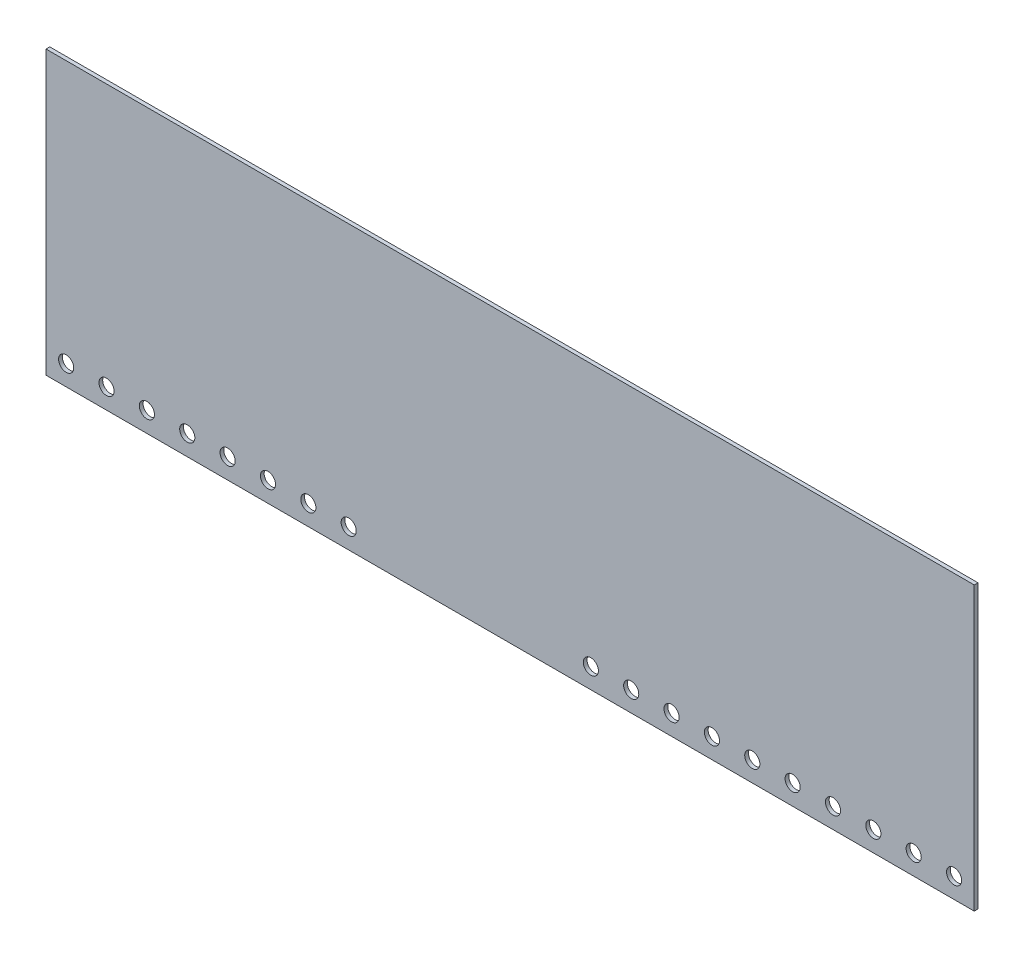
ISO-10303-21;
HEADER;
FILE_DESCRIPTION(('STEP AP214'),'2;1');
FILE_NAME('part.step','',(''),(''),'','','');
FILE_SCHEMA(('AUTOMOTIVE_DESIGN { 1 0 10303 214 1 1 1 1 }'));
ENDSEC;
DATA;
#1=APPLICATION_CONTEXT('core data for automotive mechanical design processes');
#2=APPLICATION_PROTOCOL_DEFINITION('international standard','automotive_design',2000,#1);
#3=PRODUCT_CONTEXT('',#1,'mechanical');
#4=PRODUCT('Part','Part','',(#3));
#5=PRODUCT_RELATED_PRODUCT_CATEGORY('part','',(#4));
#6=PRODUCT_DEFINITION_FORMATION('','',#4);
#7=PRODUCT_DEFINITION_CONTEXT('part definition',#1,'design');
#8=PRODUCT_DEFINITION('design','',#6,#7);
#9=PRODUCT_DEFINITION_SHAPE('','',#8);
#10=(LENGTH_UNIT() NAMED_UNIT(*) SI_UNIT(.MILLI.,.METRE.));
#11=(NAMED_UNIT(*) PLANE_ANGLE_UNIT() SI_UNIT($,.RADIAN.));
#12=(NAMED_UNIT(*) SI_UNIT($,.STERADIAN.) SOLID_ANGLE_UNIT());
#13=UNCERTAINTY_MEASURE_WITH_UNIT(LENGTH_MEASURE(1.E-05),#10,'distance_accuracy_value','');
#14=(GEOMETRIC_REPRESENTATION_CONTEXT(3) GLOBAL_UNCERTAINTY_ASSIGNED_CONTEXT((#13)) GLOBAL_UNIT_ASSIGNED_CONTEXT((#10,
#11,#12)) REPRESENTATION_CONTEXT('',''));
#15=CARTESIAN_POINT('',(0.,0.,0.));
#16=DIRECTION('',(0.,0.,1.));
#17=DIRECTION('',(1.,0.,0.));
#18=AXIS2_PLACEMENT_3D('',#15,#16,#17);
#19=CARTESIAN_POINT('',(0.,0.,1.1811));
#20=DIRECTION('',(0.,0.,-1.));
#21=DIRECTION('',(-1.,0.,0.));
#22=AXIS2_PLACEMENT_3D('',#19,#20,#21);
#23=PLANE('',#22);
#24=DIRECTION('',(0.,-1.,0.));
#25=VECTOR('',#24,1.);
#26=CARTESIAN_POINT('',(-314.17952235108,-37.0940847558031,1.1811));
#27=LINE('',#26,#25);
#28=CARTESIAN_POINT('',(-314.17952235108,140.705915244197,1.1811));
#29=VERTEX_POINT('',#28);
#30=CARTESIAN_POINT('',(-314.17952235108,-37.0940847558031,1.1811));
#31=VERTEX_POINT('',#30);
#32=EDGE_CURVE('E85',#29,#31,#27,.T.);
#33=ORIENTED_EDGE('',*,*,#32,.T.);
#34=DIRECTION('',(1.,0.,0.));
#35=VECTOR('',#34,1.);
#36=CARTESIAN_POINT('',(-314.17952235108,-37.0940847558031,1.1811));
#37=LINE('',#36,#35);
#38=CARTESIAN_POINT('',(270.02047764892,-37.0940847558031,1.1811));
#39=VERTEX_POINT('',#38);
#40=EDGE_CURVE('E80',#31,#39,#37,.T.);
#41=ORIENTED_EDGE('',*,*,#40,.T.);
#42=DIRECTION('',(0.,1.,0.));
#43=VECTOR('',#42,1.);
#44=CARTESIAN_POINT('',(270.02047764892,-37.0940847558031,1.1811));
#45=LINE('',#44,#43);
#46=CARTESIAN_POINT('',(270.02047764892,140.705915244197,1.1811));
#47=VERTEX_POINT('',#46);
#48=EDGE_CURVE('E83',#39,#47,#45,.T.);
#49=ORIENTED_EDGE('',*,*,#48,.T.);
#50=DIRECTION('',(-1.,0.,0.));
#51=VECTOR('',#50,1.);
#52=CARTESIAN_POINT('',(-314.17952235108,140.705915244197,1.1811));
#53=LINE('',#52,#51);
#54=EDGE_CURVE('E50',#47,#29,#53,.T.);
#55=ORIENTED_EDGE('',*,*,#54,.T.);
#56=EDGE_LOOP('',(#33,#41,#49,#55));
#57=FACE_BOUND('',#56,.T.);
#58=CARTESIAN_POINT('',(-301.47952235108,-24.3940847558031,1.1811));
#59=DIRECTION('',(0.,0.,1.));
#60=DIRECTION('',(1.,0.,0.));
#61=AXIS2_PLACEMENT_3D('',#58,#59,#60);
#62=CIRCLE('',#61,4.76250000000003);
#63=CARTESIAN_POINT('',(-296.71702235108,-24.3940847558031,1.1811));
#64=VERTEX_POINT('',#63);
#65=EDGE_CURVE('E100',#64,#64,#62,.T.);
#66=ORIENTED_EDGE('',*,*,#65,.F.);
#67=EDGE_LOOP('',(#66));
#68=FACE_BOUND('',#67,.T.);
#69=CARTESIAN_POINT('',(-276.07952235108,-24.3940847558031,1.1811));
#70=DIRECTION('',(0.,0.,1.));
#71=DIRECTION('',(1.,0.,0.));
#72=AXIS2_PLACEMENT_3D('',#69,#70,#71);
#73=CIRCLE('',#72,4.76249999999994);
#74=CARTESIAN_POINT('',(-271.31702235108,-24.3940847558031,1.1811));
#75=VERTEX_POINT('',#74);
#76=EDGE_CURVE('E115',#75,#75,#73,.T.);
#77=ORIENTED_EDGE('',*,*,#76,.F.);
#78=EDGE_LOOP('',(#77));
#79=FACE_BOUND('',#78,.T.);
#80=CARTESIAN_POINT('',(-250.67952235108,-24.3940847558031,1.1811));
#81=DIRECTION('',(0.,0.,1.));
#82=DIRECTION('',(1.,0.,0.));
#83=AXIS2_PLACEMENT_3D('',#80,#81,#82);
#84=CIRCLE('',#83,4.76249999999994);
#85=CARTESIAN_POINT('',(-245.91702235108,-24.3940847558031,1.1811));
#86=VERTEX_POINT('',#85);
#87=EDGE_CURVE('E121',#86,#86,#84,.T.);
#88=ORIENTED_EDGE('',*,*,#87,.F.);
#89=EDGE_LOOP('',(#88));
#90=FACE_BOUND('',#89,.T.);
#91=CARTESIAN_POINT('',(-225.27952235108,-24.3940847558031,1.1811));
#92=DIRECTION('',(0.,0.,1.));
#93=DIRECTION('',(1.,0.,0.));
#94=AXIS2_PLACEMENT_3D('',#91,#92,#93);
#95=CIRCLE('',#94,4.76249999999994);
#96=CARTESIAN_POINT('',(-220.51702235108,-24.3940847558031,1.1811));
#97=VERTEX_POINT('',#96);
#98=EDGE_CURVE('E127',#97,#97,#95,.T.);
#99=ORIENTED_EDGE('',*,*,#98,.F.);
#100=EDGE_LOOP('',(#99));
#101=FACE_BOUND('',#100,.T.);
#102=CARTESIAN_POINT('',(-199.87952235108,-24.3940847558031,1.1811));
#103=DIRECTION('',(0.,0.,1.));
#104=DIRECTION('',(1.,0.,0.));
#105=AXIS2_PLACEMENT_3D('',#102,#103,#104);
#106=CIRCLE('',#105,4.76249999999994);
#107=CARTESIAN_POINT('',(-195.11702235108,-24.3940847558031,1.1811));
#108=VERTEX_POINT('',#107);
#109=EDGE_CURVE('E133',#108,#108,#106,.T.);
#110=ORIENTED_EDGE('',*,*,#109,.F.);
#111=EDGE_LOOP('',(#110));
#112=FACE_BOUND('',#111,.T.);
#113=CARTESIAN_POINT('',(-174.47952235108,-24.3940847558031,1.1811));
#114=DIRECTION('',(0.,0.,1.));
#115=DIRECTION('',(1.,0.,0.));
#116=AXIS2_PLACEMENT_3D('',#113,#114,#115);
#117=CIRCLE('',#116,4.76249999999994);
#118=CARTESIAN_POINT('',(-169.71702235108,-24.3940847558031,1.1811));
#119=VERTEX_POINT('',#118);
#120=EDGE_CURVE('E139',#119,#119,#117,.T.);
#121=ORIENTED_EDGE('',*,*,#120,.F.);
#122=EDGE_LOOP('',(#121));
#123=FACE_BOUND('',#122,.T.);
#124=CARTESIAN_POINT('',(-149.07952235108,-24.3940847558031,1.1811));
#125=DIRECTION('',(0.,0.,1.));
#126=DIRECTION('',(1.,0.,0.));
#127=AXIS2_PLACEMENT_3D('',#124,#125,#126);
#128=CIRCLE('',#127,4.76249999999994);
#129=CARTESIAN_POINT('',(-144.31702235108,-24.3940847558031,1.1811));
#130=VERTEX_POINT('',#129);
#131=EDGE_CURVE('E145',#130,#130,#128,.T.);
#132=ORIENTED_EDGE('',*,*,#131,.F.);
#133=EDGE_LOOP('',(#132));
#134=FACE_BOUND('',#133,.T.);
#135=CARTESIAN_POINT('',(-123.67952235108,-24.3940847558031,1.1811));
#136=DIRECTION('',(0.,0.,1.));
#137=DIRECTION('',(1.,0.,0.));
#138=AXIS2_PLACEMENT_3D('',#135,#136,#137);
#139=CIRCLE('',#138,4.76250000000003);
#140=CARTESIAN_POINT('',(-118.91702235108,-24.3940847558031,1.1811));
#141=VERTEX_POINT('',#140);
#142=EDGE_CURVE('E151',#141,#141,#139,.T.);
#143=ORIENTED_EDGE('',*,*,#142,.F.);
#144=EDGE_LOOP('',(#143));
#145=FACE_BOUND('',#144,.T.);
#146=CARTESIAN_POINT('',(28.7204776489202,-24.3940847558031,1.1811));
#147=DIRECTION('',(0.,0.,1.));
#148=DIRECTION('',(1.,0.,0.));
#149=AXIS2_PLACEMENT_3D('',#146,#147,#148);
#150=CIRCLE('',#149,4.76249999999999);
#151=CARTESIAN_POINT('',(33.4829776489201,-24.3940847558031,1.1811));
#152=VERTEX_POINT('',#151);
#153=EDGE_CURVE('E157',#152,#152,#150,.T.);
#154=ORIENTED_EDGE('',*,*,#153,.F.);
#155=EDGE_LOOP('',(#154));
#156=FACE_BOUND('',#155,.T.);
#157=CARTESIAN_POINT('',(54.1204776489201,-24.3940847558027,1.1811));
#158=DIRECTION('',(0.,0.,1.));
#159=DIRECTION('',(1.,0.,0.));
#160=AXIS2_PLACEMENT_3D('',#157,#158,#159);
#161=CIRCLE('',#160,4.76249999999999);
#162=CARTESIAN_POINT('',(58.8829776489201,-24.3940847558027,1.1811));
#163=VERTEX_POINT('',#162);
#164=EDGE_CURVE('E163',#163,#163,#161,.T.);
#165=ORIENTED_EDGE('',*,*,#164,.F.);
#166=EDGE_LOOP('',(#165));
#167=FACE_BOUND('',#166,.T.);
#168=CARTESIAN_POINT('',(79.5204776489201,-24.3940847558024,1.1811));
#169=DIRECTION('',(0.,0.,1.));
#170=DIRECTION('',(1.,0.,0.));
#171=AXIS2_PLACEMENT_3D('',#168,#169,#170);
#172=CIRCLE('',#171,4.76249999999999);
#173=CARTESIAN_POINT('',(84.2829776489201,-24.3940847558024,1.1811));
#174=VERTEX_POINT('',#173);
#175=EDGE_CURVE('E169',#174,#174,#172,.T.);
#176=ORIENTED_EDGE('',*,*,#175,.F.);
#177=EDGE_LOOP('',(#176));
#178=FACE_BOUND('',#177,.T.);
#179=CARTESIAN_POINT('',(104.92047764892,-24.394084755802,1.1811));
#180=DIRECTION('',(0.,0.,1.));
#181=DIRECTION('',(1.,0.,0.));
#182=AXIS2_PLACEMENT_3D('',#179,#180,#181);
#183=CIRCLE('',#182,4.76249999999989);
#184=CARTESIAN_POINT('',(109.68297764892,-24.394084755802,1.1811));
#185=VERTEX_POINT('',#184);
#186=EDGE_CURVE('E175',#185,#185,#183,.T.);
#187=ORIENTED_EDGE('',*,*,#186,.F.);
#188=EDGE_LOOP('',(#187));
#189=FACE_BOUND('',#188,.T.);
#190=CARTESIAN_POINT('',(130.32047764892,-24.3940847558016,1.1811));
#191=DIRECTION('',(0.,0.,1.));
#192=DIRECTION('',(1.,0.,0.));
#193=AXIS2_PLACEMENT_3D('',#190,#191,#192);
#194=CIRCLE('',#193,4.76249999999999);
#195=CARTESIAN_POINT('',(135.08297764892,-24.3940847558016,1.1811));
#196=VERTEX_POINT('',#195);
#197=EDGE_CURVE('E181',#196,#196,#194,.T.);
#198=ORIENTED_EDGE('',*,*,#197,.F.);
#199=EDGE_LOOP('',(#198));
#200=FACE_BOUND('',#199,.T.);
#201=CARTESIAN_POINT('',(155.72047764892,-24.3940847558013,1.1811));
#202=DIRECTION('',(0.,0.,1.));
#203=DIRECTION('',(1.,0.,0.));
#204=AXIS2_PLACEMENT_3D('',#201,#202,#203);
#205=CIRCLE('',#204,4.76249999999999);
#206=CARTESIAN_POINT('',(160.48297764892,-24.3940847558013,1.1811));
#207=VERTEX_POINT('',#206);
#208=EDGE_CURVE('E187',#207,#207,#205,.T.);
#209=ORIENTED_EDGE('',*,*,#208,.F.);
#210=EDGE_LOOP('',(#209));
#211=FACE_BOUND('',#210,.T.);
#212=CARTESIAN_POINT('',(181.12047764892,-24.394084755801,1.1811));
#213=DIRECTION('',(0.,0.,1.));
#214=DIRECTION('',(1.,0.,0.));
#215=AXIS2_PLACEMENT_3D('',#212,#213,#214);
#216=CIRCLE('',#215,4.76249999999999);
#217=CARTESIAN_POINT('',(185.88297764892,-24.394084755801,1.1811));
#218=VERTEX_POINT('',#217);
#219=EDGE_CURVE('E193',#218,#218,#216,.T.);
#220=ORIENTED_EDGE('',*,*,#219,.F.);
#221=EDGE_LOOP('',(#220));
#222=FACE_BOUND('',#221,.T.);
#223=CARTESIAN_POINT('',(206.52047764892,-24.3940847558006,1.1811));
#224=DIRECTION('',(0.,0.,1.));
#225=DIRECTION('',(1.,0.,0.));
#226=AXIS2_PLACEMENT_3D('',#223,#224,#225);
#227=CIRCLE('',#226,4.76249999999999);
#228=CARTESIAN_POINT('',(211.28297764892,-24.3940847558006,1.1811));
#229=VERTEX_POINT('',#228);
#230=EDGE_CURVE('E199',#229,#229,#227,.T.);
#231=ORIENTED_EDGE('',*,*,#230,.F.);
#232=EDGE_LOOP('',(#231));
#233=FACE_BOUND('',#232,.T.);
#234=CARTESIAN_POINT('',(231.92047764892,-24.3940847558002,1.1811));
#235=DIRECTION('',(0.,0.,1.));
#236=DIRECTION('',(1.,0.,0.));
#237=AXIS2_PLACEMENT_3D('',#234,#235,#236);
#238=CIRCLE('',#237,4.76249999999989);
#239=CARTESIAN_POINT('',(236.68297764892,-24.3940847558002,1.1811));
#240=VERTEX_POINT('',#239);
#241=EDGE_CURVE('E205',#240,#240,#238,.T.);
#242=ORIENTED_EDGE('',*,*,#241,.F.);
#243=EDGE_LOOP('',(#242));
#244=FACE_BOUND('',#243,.T.);
#245=CARTESIAN_POINT('',(257.32047764892,-24.3940847557998,1.1811));
#246=DIRECTION('',(0.,0.,1.));
#247=DIRECTION('',(1.,0.,0.));
#248=AXIS2_PLACEMENT_3D('',#245,#246,#247);
#249=CIRCLE('',#248,4.76249999999999);
#250=CARTESIAN_POINT('',(262.08297764892,-24.3940847557998,1.1811));
#251=VERTEX_POINT('',#250);
#252=EDGE_CURVE('E211',#251,#251,#249,.T.);
#253=ORIENTED_EDGE('',*,*,#252,.F.);
#254=EDGE_LOOP('',(#253));
#255=FACE_BOUND('',#254,.T.);
#256=ADVANCED_FACE('F33',(#57,#68,#79,#90,#101,#112,#123,#134,#145,#156,#167,#178,#189,#200,
#211,#222,#233,#244,#255),#23,.F.);
#257=CARTESIAN_POINT('',(0.,0.,-1.1811));
#258=DIRECTION('',(0.,0.,-1.));
#259=DIRECTION('',(-1.,0.,0.));
#260=AXIS2_PLACEMENT_3D('',#257,#258,#259);
#261=PLANE('',#260);
#262=CARTESIAN_POINT('',(231.92047764892,-24.3940847558002,-1.1811));
#263=DIRECTION('',(0.,0.,1.));
#264=DIRECTION('',(1.,0.,0.));
#265=AXIS2_PLACEMENT_3D('',#262,#263,#264);
#266=CIRCLE('',#265,4.76249999999989);
#267=CARTESIAN_POINT('',(236.68297764892,-24.3940847558002,-1.1811));
#268=VERTEX_POINT('',#267);
#269=EDGE_CURVE('E208',#268,#268,#266,.T.);
#270=ORIENTED_EDGE('',*,*,#269,.T.);
#271=EDGE_LOOP('',(#270));
#272=FACE_BOUND('',#271,.T.);
#273=CARTESIAN_POINT('',(181.12047764892,-24.394084755801,-1.1811));
#274=DIRECTION('',(0.,0.,1.));
#275=DIRECTION('',(1.,0.,0.));
#276=AXIS2_PLACEMENT_3D('',#273,#274,#275);
#277=CIRCLE('',#276,4.76249999999999);
#278=CARTESIAN_POINT('',(185.88297764892,-24.394084755801,-1.1811));
#279=VERTEX_POINT('',#278);
#280=EDGE_CURVE('E196',#279,#279,#277,.T.);
#281=ORIENTED_EDGE('',*,*,#280,.T.);
#282=EDGE_LOOP('',(#281));
#283=FACE_BOUND('',#282,.T.);
#284=CARTESIAN_POINT('',(130.32047764892,-24.3940847558016,-1.1811));
#285=DIRECTION('',(0.,0.,1.));
#286=DIRECTION('',(1.,0.,0.));
#287=AXIS2_PLACEMENT_3D('',#284,#285,#286);
#288=CIRCLE('',#287,4.76249999999999);
#289=CARTESIAN_POINT('',(135.08297764892,-24.3940847558016,-1.1811));
#290=VERTEX_POINT('',#289);
#291=EDGE_CURVE('E184',#290,#290,#288,.T.);
#292=ORIENTED_EDGE('',*,*,#291,.T.);
#293=EDGE_LOOP('',(#292));
#294=FACE_BOUND('',#293,.T.);
#295=CARTESIAN_POINT('',(79.5204776489201,-24.3940847558024,-1.1811));
#296=DIRECTION('',(0.,0.,1.));
#297=DIRECTION('',(1.,0.,0.));
#298=AXIS2_PLACEMENT_3D('',#295,#296,#297);
#299=CIRCLE('',#298,4.76249999999999);
#300=CARTESIAN_POINT('',(84.2829776489201,-24.3940847558024,-1.1811));
#301=VERTEX_POINT('',#300);
#302=EDGE_CURVE('E172',#301,#301,#299,.T.);
#303=ORIENTED_EDGE('',*,*,#302,.T.);
#304=EDGE_LOOP('',(#303));
#305=FACE_BOUND('',#304,.T.);
#306=CARTESIAN_POINT('',(28.7204776489202,-24.3940847558031,-1.1811));
#307=DIRECTION('',(0.,0.,1.));
#308=DIRECTION('',(1.,0.,0.));
#309=AXIS2_PLACEMENT_3D('',#306,#307,#308);
#310=CIRCLE('',#309,4.76249999999999);
#311=CARTESIAN_POINT('',(33.4829776489201,-24.3940847558031,-1.1811));
#312=VERTEX_POINT('',#311);
#313=EDGE_CURVE('E160',#312,#312,#310,.T.);
#314=ORIENTED_EDGE('',*,*,#313,.T.);
#315=EDGE_LOOP('',(#314));
#316=FACE_BOUND('',#315,.T.);
#317=CARTESIAN_POINT('',(-149.07952235108,-24.3940847558031,-1.1811));
#318=DIRECTION('',(0.,0.,1.));
#319=DIRECTION('',(1.,0.,0.));
#320=AXIS2_PLACEMENT_3D('',#317,#318,#319);
#321=CIRCLE('',#320,4.76249999999994);
#322=CARTESIAN_POINT('',(-144.31702235108,-24.3940847558031,-1.1811));
#323=VERTEX_POINT('',#322);
#324=EDGE_CURVE('E148',#323,#323,#321,.T.);
#325=ORIENTED_EDGE('',*,*,#324,.T.);
#326=EDGE_LOOP('',(#325));
#327=FACE_BOUND('',#326,.T.);
#328=CARTESIAN_POINT('',(-199.87952235108,-24.3940847558031,-1.1811));
#329=DIRECTION('',(0.,0.,1.));
#330=DIRECTION('',(1.,0.,0.));
#331=AXIS2_PLACEMENT_3D('',#328,#329,#330);
#332=CIRCLE('',#331,4.76249999999994);
#333=CARTESIAN_POINT('',(-195.11702235108,-24.3940847558031,-1.1811));
#334=VERTEX_POINT('',#333);
#335=EDGE_CURVE('E136',#334,#334,#332,.T.);
#336=ORIENTED_EDGE('',*,*,#335,.T.);
#337=EDGE_LOOP('',(#336));
#338=FACE_BOUND('',#337,.T.);
#339=CARTESIAN_POINT('',(-250.67952235108,-24.3940847558031,-1.1811));
#340=DIRECTION('',(0.,0.,1.));
#341=DIRECTION('',(1.,0.,0.));
#342=AXIS2_PLACEMENT_3D('',#339,#340,#341);
#343=CIRCLE('',#342,4.76249999999994);
#344=CARTESIAN_POINT('',(-245.91702235108,-24.3940847558031,-1.1811));
#345=VERTEX_POINT('',#344);
#346=EDGE_CURVE('E124',#345,#345,#343,.T.);
#347=ORIENTED_EDGE('',*,*,#346,.T.);
#348=EDGE_LOOP('',(#347));
#349=FACE_BOUND('',#348,.T.);
#350=CARTESIAN_POINT('',(-301.47952235108,-24.3940847558031,-1.1811));
#351=DIRECTION('',(0.,0.,1.));
#352=DIRECTION('',(1.,0.,0.));
#353=AXIS2_PLACEMENT_3D('',#350,#351,#352);
#354=CIRCLE('',#353,4.76250000000003);
#355=CARTESIAN_POINT('',(-296.71702235108,-24.3940847558031,-1.1811));
#356=VERTEX_POINT('',#355);
#357=EDGE_CURVE('E112',#356,#356,#354,.T.);
#358=ORIENTED_EDGE('',*,*,#357,.T.);
#359=EDGE_LOOP('',(#358));
#360=FACE_BOUND('',#359,.T.);
#361=DIRECTION('',(0.,-1.,0.));
#362=VECTOR('',#361,1.);
#363=CARTESIAN_POINT('',(-314.17952235108,-37.0940847558031,-1.1811));
#364=LINE('',#363,#362);
#365=CARTESIAN_POINT('',(-314.17952235108,140.705915244197,-1.1811));
#366=VERTEX_POINT('',#365);
#367=CARTESIAN_POINT('',(-314.17952235108,-37.0940847558031,-1.1811));
#368=VERTEX_POINT('',#367);
#369=EDGE_CURVE('E97',#366,#368,#364,.T.);
#370=ORIENTED_EDGE('',*,*,#369,.F.);
#371=DIRECTION('',(-1.,0.,0.));
#372=VECTOR('',#371,1.);
#373=CARTESIAN_POINT('',(-314.17952235108,140.705915244197,-1.1811));
#374=LINE('',#373,#372);
#375=CARTESIAN_POINT('',(270.02047764892,140.705915244197,-1.1811));
#376=VERTEX_POINT('',#375);
#377=EDGE_CURVE('E73',#376,#366,#374,.T.);
#378=ORIENTED_EDGE('',*,*,#377,.F.);
#379=DIRECTION('',(0.,1.,0.));
#380=VECTOR('',#379,1.);
#381=CARTESIAN_POINT('',(270.02047764892,-37.0940847558031,-1.1811));
#382=LINE('',#381,#380);
#383=CARTESIAN_POINT('',(270.02047764892,-37.0940847558031,-1.1811));
#384=VERTEX_POINT('',#383);
#385=EDGE_CURVE('E67',#384,#376,#382,.T.);
#386=ORIENTED_EDGE('',*,*,#385,.F.);
#387=DIRECTION('',(1.,0.,0.));
#388=VECTOR('',#387,1.);
#389=CARTESIAN_POINT('',(-314.17952235108,-37.0940847558031,-1.1811));
#390=LINE('',#389,#388);
#391=EDGE_CURVE('E89',#368,#384,#390,.T.);
#392=ORIENTED_EDGE('',*,*,#391,.F.);
#393=EDGE_LOOP('',(#370,#378,#386,#392));
#394=FACE_BOUND('',#393,.T.);
#395=CARTESIAN_POINT('',(-276.07952235108,-24.3940847558031,-1.1811));
#396=DIRECTION('',(0.,0.,1.));
#397=DIRECTION('',(1.,0.,0.));
#398=AXIS2_PLACEMENT_3D('',#395,#396,#397);
#399=CIRCLE('',#398,4.76249999999994);
#400=CARTESIAN_POINT('',(-271.31702235108,-24.3940847558031,-1.1811));
#401=VERTEX_POINT('',#400);
#402=EDGE_CURVE('E118',#401,#401,#399,.T.);
#403=ORIENTED_EDGE('',*,*,#402,.T.);
#404=EDGE_LOOP('',(#403));
#405=FACE_BOUND('',#404,.T.);
#406=CARTESIAN_POINT('',(-225.27952235108,-24.3940847558031,-1.1811));
#407=DIRECTION('',(0.,0.,1.));
#408=DIRECTION('',(1.,0.,0.));
#409=AXIS2_PLACEMENT_3D('',#406,#407,#408);
#410=CIRCLE('',#409,4.76249999999994);
#411=CARTESIAN_POINT('',(-220.51702235108,-24.3940847558031,-1.1811));
#412=VERTEX_POINT('',#411);
#413=EDGE_CURVE('E130',#412,#412,#410,.T.);
#414=ORIENTED_EDGE('',*,*,#413,.T.);
#415=EDGE_LOOP('',(#414));
#416=FACE_BOUND('',#415,.T.);
#417=CARTESIAN_POINT('',(-174.47952235108,-24.3940847558031,-1.1811));
#418=DIRECTION('',(0.,0.,1.));
#419=DIRECTION('',(1.,0.,0.));
#420=AXIS2_PLACEMENT_3D('',#417,#418,#419);
#421=CIRCLE('',#420,4.76249999999994);
#422=CARTESIAN_POINT('',(-169.71702235108,-24.3940847558031,-1.1811));
#423=VERTEX_POINT('',#422);
#424=EDGE_CURVE('E142',#423,#423,#421,.T.);
#425=ORIENTED_EDGE('',*,*,#424,.T.);
#426=EDGE_LOOP('',(#425));
#427=FACE_BOUND('',#426,.T.);
#428=CARTESIAN_POINT('',(-123.67952235108,-24.3940847558031,-1.1811));
#429=DIRECTION('',(0.,0.,1.));
#430=DIRECTION('',(1.,0.,0.));
#431=AXIS2_PLACEMENT_3D('',#428,#429,#430);
#432=CIRCLE('',#431,4.76250000000003);
#433=CARTESIAN_POINT('',(-118.91702235108,-24.3940847558031,-1.1811));
#434=VERTEX_POINT('',#433);
#435=EDGE_CURVE('E154',#434,#434,#432,.T.);
#436=ORIENTED_EDGE('',*,*,#435,.T.);
#437=EDGE_LOOP('',(#436));
#438=FACE_BOUND('',#437,.T.);
#439=CARTESIAN_POINT('',(54.1204776489201,-24.3940847558027,-1.1811));
#440=DIRECTION('',(0.,0.,1.));
#441=DIRECTION('',(1.,0.,0.));
#442=AXIS2_PLACEMENT_3D('',#439,#440,#441);
#443=CIRCLE('',#442,4.76249999999999);
#444=CARTESIAN_POINT('',(58.8829776489201,-24.3940847558027,-1.1811));
#445=VERTEX_POINT('',#444);
#446=EDGE_CURVE('E166',#445,#445,#443,.T.);
#447=ORIENTED_EDGE('',*,*,#446,.T.);
#448=EDGE_LOOP('',(#447));
#449=FACE_BOUND('',#448,.T.);
#450=CARTESIAN_POINT('',(104.92047764892,-24.394084755802,-1.1811));
#451=DIRECTION('',(0.,0.,1.));
#452=DIRECTION('',(1.,0.,0.));
#453=AXIS2_PLACEMENT_3D('',#450,#451,#452);
#454=CIRCLE('',#453,4.76249999999989);
#455=CARTESIAN_POINT('',(109.68297764892,-24.394084755802,-1.1811));
#456=VERTEX_POINT('',#455);
#457=EDGE_CURVE('E178',#456,#456,#454,.T.);
#458=ORIENTED_EDGE('',*,*,#457,.T.);
#459=EDGE_LOOP('',(#458));
#460=FACE_BOUND('',#459,.T.);
#461=CARTESIAN_POINT('',(155.72047764892,-24.3940847558013,-1.1811));
#462=DIRECTION('',(0.,0.,1.));
#463=DIRECTION('',(1.,0.,0.));
#464=AXIS2_PLACEMENT_3D('',#461,#462,#463);
#465=CIRCLE('',#464,4.76249999999999);
#466=CARTESIAN_POINT('',(160.48297764892,-24.3940847558013,-1.1811));
#467=VERTEX_POINT('',#466);
#468=EDGE_CURVE('E190',#467,#467,#465,.T.);
#469=ORIENTED_EDGE('',*,*,#468,.T.);
#470=EDGE_LOOP('',(#469));
#471=FACE_BOUND('',#470,.T.);
#472=CARTESIAN_POINT('',(206.52047764892,-24.3940847558006,-1.1811));
#473=DIRECTION('',(0.,0.,1.));
#474=DIRECTION('',(1.,0.,0.));
#475=AXIS2_PLACEMENT_3D('',#472,#473,#474);
#476=CIRCLE('',#475,4.76249999999999);
#477=CARTESIAN_POINT('',(211.28297764892,-24.3940847558006,-1.1811));
#478=VERTEX_POINT('',#477);
#479=EDGE_CURVE('E202',#478,#478,#476,.T.);
#480=ORIENTED_EDGE('',*,*,#479,.T.);
#481=EDGE_LOOP('',(#480));
#482=FACE_BOUND('',#481,.T.);
#483=CARTESIAN_POINT('',(257.32047764892,-24.3940847557998,-1.1811));
#484=DIRECTION('',(0.,0.,1.));
#485=DIRECTION('',(1.,0.,0.));
#486=AXIS2_PLACEMENT_3D('',#483,#484,#485);
#487=CIRCLE('',#486,4.76249999999999);
#488=CARTESIAN_POINT('',(262.08297764892,-24.3940847557998,-1.1811));
#489=VERTEX_POINT('',#488);
#490=EDGE_CURVE('E214',#489,#489,#487,.T.);
#491=ORIENTED_EDGE('',*,*,#490,.T.);
#492=EDGE_LOOP('',(#491));
#493=FACE_BOUND('',#492,.T.);
#494=ADVANCED_FACE('F108',(#272,#283,#294,#305,#316,#327,#338,#349,#360,#394,#405,#416,#427,
#438,#449,#460,#471,#482,#493),#261,.T.);
#495=CARTESIAN_POINT('',(-314.17952235108,-37.0940847558031,1.1811));
#496=DIRECTION('',(1.,0.,0.));
#497=DIRECTION('',(0.,0.,-1.));
#498=AXIS2_PLACEMENT_3D('',#495,#496,#497);
#499=PLANE('',#498);
#500=ORIENTED_EDGE('',*,*,#369,.T.);
#501=DIRECTION('',(0.,0.,-1.));
#502=VECTOR('',#501,1.);
#503=CARTESIAN_POINT('',(-314.17952235108,-37.0940847558031,1.1811));
#504=LINE('',#503,#502);
#505=EDGE_CURVE('E11',#31,#368,#504,.T.);
#506=ORIENTED_EDGE('',*,*,#505,.F.);
#507=ORIENTED_EDGE('',*,*,#32,.F.);
#508=DIRECTION('',(0.,0.,-1.));
#509=VECTOR('',#508,1.);
#510=CARTESIAN_POINT('',(-314.17952235108,140.705915244197,1.1811));
#511=LINE('',#510,#509);
#512=EDGE_CURVE('E93',#29,#366,#511,.T.);
#513=ORIENTED_EDGE('',*,*,#512,.T.);
#514=EDGE_LOOP('',(#500,#506,#507,#513));
#515=FACE_BOUND('',#514,.T.);
#516=ADVANCED_FACE('F35',(#515),#499,.F.);
#517=CARTESIAN_POINT('',(-314.17952235108,-37.0940847558031,1.1811));
#518=DIRECTION('',(0.,1.,0.));
#519=DIRECTION('',(0.,0.,1.));
#520=AXIS2_PLACEMENT_3D('',#517,#518,#519);
#521=PLANE('',#520);
#522=ORIENTED_EDGE('',*,*,#391,.T.);
#523=DIRECTION('',(0.,0.,-1.));
#524=VECTOR('',#523,1.);
#525=CARTESIAN_POINT('',(270.02047764892,-37.0940847558031,1.1811));
#526=LINE('',#525,#524);
#527=EDGE_CURVE('E42',#39,#384,#526,.T.);
#528=ORIENTED_EDGE('',*,*,#527,.F.);
#529=ORIENTED_EDGE('',*,*,#40,.F.);
#530=ORIENTED_EDGE('',*,*,#505,.T.);
#531=EDGE_LOOP('',(#522,#528,#529,#530));
#532=FACE_BOUND('',#531,.T.);
#533=ADVANCED_FACE('F88',(#532),#521,.F.);
#534=CARTESIAN_POINT('',(270.02047764892,-37.0940847558031,1.1811));
#535=DIRECTION('',(-1.,0.,0.));
#536=DIRECTION('',(0.,0.,1.));
#537=AXIS2_PLACEMENT_3D('',#534,#535,#536);
#538=PLANE('',#537);
#539=ORIENTED_EDGE('',*,*,#385,.T.);
#540=DIRECTION('',(0.,0.,-1.));
#541=VECTOR('',#540,1.);
#542=CARTESIAN_POINT('',(270.02047764892,140.705915244197,1.1811));
#543=LINE('',#542,#541);
#544=EDGE_CURVE('E90',#47,#376,#543,.T.);
#545=ORIENTED_EDGE('',*,*,#544,.F.);
#546=ORIENTED_EDGE('',*,*,#48,.F.);
#547=ORIENTED_EDGE('',*,*,#527,.T.);
#548=EDGE_LOOP('',(#539,#545,#546,#547));
#549=FACE_BOUND('',#548,.T.);
#550=ADVANCED_FACE('F91',(#549),#538,.F.);
#551=CARTESIAN_POINT('',(-314.17952235108,140.705915244197,1.1811));
#552=DIRECTION('',(0.,-1.,0.));
#553=DIRECTION('',(0.,0.,-1.));
#554=AXIS2_PLACEMENT_3D('',#551,#552,#553);
#555=PLANE('',#554);
#556=ORIENTED_EDGE('',*,*,#377,.T.);
#557=ORIENTED_EDGE('',*,*,#512,.F.);
#558=ORIENTED_EDGE('',*,*,#54,.F.);
#559=ORIENTED_EDGE('',*,*,#544,.T.);
#560=EDGE_LOOP('',(#556,#557,#558,#559));
#561=FACE_BOUND('',#560,.T.);
#562=ADVANCED_FACE('F105',(#561),#555,.F.);
#563=CARTESIAN_POINT('',(-301.47952235108,-24.3940847558031,1.1811));
#564=DIRECTION('',(0.,0.,-1.));
#565=DIRECTION('',(-1.,0.,0.));
#566=AXIS2_PLACEMENT_3D('',#563,#564,#565);
#567=CYLINDRICAL_SURFACE('',#566,4.76250000000003);
#568=ORIENTED_EDGE('',*,*,#65,.T.);
#569=EDGE_LOOP('',(#568));
#570=FACE_BOUND('',#569,.T.);
#571=ORIENTED_EDGE('',*,*,#357,.F.);
#572=EDGE_LOOP('',(#571));
#573=FACE_BOUND('',#572,.T.);
#574=ADVANCED_FACE('F231',(#570,#573),#567,.F.);
#575=CARTESIAN_POINT('',(-276.07952235108,-24.3940847558031,1.1811));
#576=DIRECTION('',(0.,0.,-1.));
#577=DIRECTION('',(-1.,0.,0.));
#578=AXIS2_PLACEMENT_3D('',#575,#576,#577);
#579=CYLINDRICAL_SURFACE('',#578,4.76249999999994);
#580=ORIENTED_EDGE('',*,*,#76,.T.);
#581=EDGE_LOOP('',(#580));
#582=FACE_BOUND('',#581,.T.);
#583=ORIENTED_EDGE('',*,*,#402,.F.);
#584=EDGE_LOOP('',(#583));
#585=FACE_BOUND('',#584,.T.);
#586=ADVANCED_FACE('F277',(#582,#585),#579,.F.);
#587=CARTESIAN_POINT('',(-250.67952235108,-24.3940847558031,1.1811));
#588=DIRECTION('',(0.,0.,-1.));
#589=DIRECTION('',(-1.,0.,0.));
#590=AXIS2_PLACEMENT_3D('',#587,#588,#589);
#591=CYLINDRICAL_SURFACE('',#590,4.76249999999994);
#592=ORIENTED_EDGE('',*,*,#87,.T.);
#593=EDGE_LOOP('',(#592));
#594=FACE_BOUND('',#593,.T.);
#595=ORIENTED_EDGE('',*,*,#346,.F.);
#596=EDGE_LOOP('',(#595));
#597=FACE_BOUND('',#596,.T.);
#598=ADVANCED_FACE('F285',(#594,#597),#591,.F.);
#599=CARTESIAN_POINT('',(-225.27952235108,-24.3940847558031,1.1811));
#600=DIRECTION('',(0.,0.,-1.));
#601=DIRECTION('',(-1.,0.,0.));
#602=AXIS2_PLACEMENT_3D('',#599,#600,#601);
#603=CYLINDRICAL_SURFACE('',#602,4.76249999999994);
#604=ORIENTED_EDGE('',*,*,#98,.T.);
#605=EDGE_LOOP('',(#604));
#606=FACE_BOUND('',#605,.T.);
#607=ORIENTED_EDGE('',*,*,#413,.F.);
#608=EDGE_LOOP('',(#607));
#609=FACE_BOUND('',#608,.T.);
#610=ADVANCED_FACE('F293',(#606,#609),#603,.F.);
#611=CARTESIAN_POINT('',(-199.87952235108,-24.3940847558031,1.1811));
#612=DIRECTION('',(0.,0.,-1.));
#613=DIRECTION('',(-1.,0.,0.));
#614=AXIS2_PLACEMENT_3D('',#611,#612,#613);
#615=CYLINDRICAL_SURFACE('',#614,4.76249999999994);
#616=ORIENTED_EDGE('',*,*,#109,.T.);
#617=EDGE_LOOP('',(#616));
#618=FACE_BOUND('',#617,.T.);
#619=ORIENTED_EDGE('',*,*,#335,.F.);
#620=EDGE_LOOP('',(#619));
#621=FACE_BOUND('',#620,.T.);
#622=ADVANCED_FACE('F302',(#618,#621),#615,.F.);
#623=CARTESIAN_POINT('',(-174.47952235108,-24.3940847558031,1.1811));
#624=DIRECTION('',(0.,0.,-1.));
#625=DIRECTION('',(-1.,0.,0.));
#626=AXIS2_PLACEMENT_3D('',#623,#624,#625);
#627=CYLINDRICAL_SURFACE('',#626,4.76249999999994);
#628=ORIENTED_EDGE('',*,*,#120,.T.);
#629=EDGE_LOOP('',(#628));
#630=FACE_BOUND('',#629,.T.);
#631=ORIENTED_EDGE('',*,*,#424,.F.);
#632=EDGE_LOOP('',(#631));
#633=FACE_BOUND('',#632,.T.);
#634=ADVANCED_FACE('F311',(#630,#633),#627,.F.);
#635=CARTESIAN_POINT('',(-149.07952235108,-24.3940847558031,1.1811));
#636=DIRECTION('',(0.,0.,-1.));
#637=DIRECTION('',(-1.,0.,0.));
#638=AXIS2_PLACEMENT_3D('',#635,#636,#637);
#639=CYLINDRICAL_SURFACE('',#638,4.76249999999994);
#640=ORIENTED_EDGE('',*,*,#131,.T.);
#641=EDGE_LOOP('',(#640));
#642=FACE_BOUND('',#641,.T.);
#643=ORIENTED_EDGE('',*,*,#324,.F.);
#644=EDGE_LOOP('',(#643));
#645=FACE_BOUND('',#644,.T.);
#646=ADVANCED_FACE('F320',(#642,#645),#639,.F.);
#647=CARTESIAN_POINT('',(-123.67952235108,-24.3940847558031,1.1811));
#648=DIRECTION('',(0.,0.,-1.));
#649=DIRECTION('',(-1.,0.,0.));
#650=AXIS2_PLACEMENT_3D('',#647,#648,#649);
#651=CYLINDRICAL_SURFACE('',#650,4.76250000000003);
#652=ORIENTED_EDGE('',*,*,#142,.T.);
#653=EDGE_LOOP('',(#652));
#654=FACE_BOUND('',#653,.T.);
#655=ORIENTED_EDGE('',*,*,#435,.F.);
#656=EDGE_LOOP('',(#655));
#657=FACE_BOUND('',#656,.T.);
#658=ADVANCED_FACE('F329',(#654,#657),#651,.F.);
#659=CARTESIAN_POINT('',(28.7204776489202,-24.3940847558031,1.1811));
#660=DIRECTION('',(0.,0.,-1.));
#661=DIRECTION('',(-1.,0.,0.));
#662=AXIS2_PLACEMENT_3D('',#659,#660,#661);
#663=CYLINDRICAL_SURFACE('',#662,4.76249999999999);
#664=ORIENTED_EDGE('',*,*,#153,.T.);
#665=EDGE_LOOP('',(#664));
#666=FACE_BOUND('',#665,.T.);
#667=ORIENTED_EDGE('',*,*,#313,.F.);
#668=EDGE_LOOP('',(#667));
#669=FACE_BOUND('',#668,.T.);
#670=ADVANCED_FACE('F338',(#666,#669),#663,.F.);
#671=CARTESIAN_POINT('',(54.1204776489201,-24.3940847558027,1.1811));
#672=DIRECTION('',(0.,0.,-1.));
#673=DIRECTION('',(-1.,0.,0.));
#674=AXIS2_PLACEMENT_3D('',#671,#672,#673);
#675=CYLINDRICAL_SURFACE('',#674,4.76249999999999);
#676=ORIENTED_EDGE('',*,*,#164,.T.);
#677=EDGE_LOOP('',(#676));
#678=FACE_BOUND('',#677,.T.);
#679=ORIENTED_EDGE('',*,*,#446,.F.);
#680=EDGE_LOOP('',(#679));
#681=FACE_BOUND('',#680,.T.);
#682=ADVANCED_FACE('F347',(#678,#681),#675,.F.);
#683=CARTESIAN_POINT('',(79.5204776489201,-24.3940847558024,1.1811));
#684=DIRECTION('',(0.,0.,-1.));
#685=DIRECTION('',(-1.,0.,0.));
#686=AXIS2_PLACEMENT_3D('',#683,#684,#685);
#687=CYLINDRICAL_SURFACE('',#686,4.76249999999999);
#688=ORIENTED_EDGE('',*,*,#175,.T.);
#689=EDGE_LOOP('',(#688));
#690=FACE_BOUND('',#689,.T.);
#691=ORIENTED_EDGE('',*,*,#302,.F.);
#692=EDGE_LOOP('',(#691));
#693=FACE_BOUND('',#692,.T.);
#694=ADVANCED_FACE('F356',(#690,#693),#687,.F.);
#695=CARTESIAN_POINT('',(104.92047764892,-24.394084755802,1.1811));
#696=DIRECTION('',(0.,0.,-1.));
#697=DIRECTION('',(-1.,0.,0.));
#698=AXIS2_PLACEMENT_3D('',#695,#696,#697);
#699=CYLINDRICAL_SURFACE('',#698,4.76249999999989);
#700=ORIENTED_EDGE('',*,*,#186,.T.);
#701=EDGE_LOOP('',(#700));
#702=FACE_BOUND('',#701,.T.);
#703=ORIENTED_EDGE('',*,*,#457,.F.);
#704=EDGE_LOOP('',(#703));
#705=FACE_BOUND('',#704,.T.);
#706=ADVANCED_FACE('F365',(#702,#705),#699,.F.);
#707=CARTESIAN_POINT('',(130.32047764892,-24.3940847558016,1.1811));
#708=DIRECTION('',(0.,0.,-1.));
#709=DIRECTION('',(-1.,0.,0.));
#710=AXIS2_PLACEMENT_3D('',#707,#708,#709);
#711=CYLINDRICAL_SURFACE('',#710,4.76249999999999);
#712=ORIENTED_EDGE('',*,*,#197,.T.);
#713=EDGE_LOOP('',(#712));
#714=FACE_BOUND('',#713,.T.);
#715=ORIENTED_EDGE('',*,*,#291,.F.);
#716=EDGE_LOOP('',(#715));
#717=FACE_BOUND('',#716,.T.);
#718=ADVANCED_FACE('F374',(#714,#717),#711,.F.);
#719=CARTESIAN_POINT('',(155.72047764892,-24.3940847558013,1.1811));
#720=DIRECTION('',(0.,0.,-1.));
#721=DIRECTION('',(-1.,0.,0.));
#722=AXIS2_PLACEMENT_3D('',#719,#720,#721);
#723=CYLINDRICAL_SURFACE('',#722,4.76249999999999);
#724=ORIENTED_EDGE('',*,*,#208,.T.);
#725=EDGE_LOOP('',(#724));
#726=FACE_BOUND('',#725,.T.);
#727=ORIENTED_EDGE('',*,*,#468,.F.);
#728=EDGE_LOOP('',(#727));
#729=FACE_BOUND('',#728,.T.);
#730=ADVANCED_FACE('F383',(#726,#729),#723,.F.);
#731=CARTESIAN_POINT('',(181.12047764892,-24.394084755801,1.1811));
#732=DIRECTION('',(0.,0.,-1.));
#733=DIRECTION('',(-1.,0.,0.));
#734=AXIS2_PLACEMENT_3D('',#731,#732,#733);
#735=CYLINDRICAL_SURFACE('',#734,4.76249999999999);
#736=ORIENTED_EDGE('',*,*,#219,.T.);
#737=EDGE_LOOP('',(#736));
#738=FACE_BOUND('',#737,.T.);
#739=ORIENTED_EDGE('',*,*,#280,.F.);
#740=EDGE_LOOP('',(#739));
#741=FACE_BOUND('',#740,.T.);
#742=ADVANCED_FACE('F392',(#738,#741),#735,.F.);
#743=CARTESIAN_POINT('',(206.52047764892,-24.3940847558006,1.1811));
#744=DIRECTION('',(0.,0.,-1.));
#745=DIRECTION('',(-1.,0.,0.));
#746=AXIS2_PLACEMENT_3D('',#743,#744,#745);
#747=CYLINDRICAL_SURFACE('',#746,4.76249999999999);
#748=ORIENTED_EDGE('',*,*,#230,.T.);
#749=EDGE_LOOP('',(#748));
#750=FACE_BOUND('',#749,.T.);
#751=ORIENTED_EDGE('',*,*,#479,.F.);
#752=EDGE_LOOP('',(#751));
#753=FACE_BOUND('',#752,.T.);
#754=ADVANCED_FACE('F401',(#750,#753),#747,.F.);
#755=CARTESIAN_POINT('',(231.92047764892,-24.3940847558002,1.1811));
#756=DIRECTION('',(0.,0.,-1.));
#757=DIRECTION('',(-1.,0.,0.));
#758=AXIS2_PLACEMENT_3D('',#755,#756,#757);
#759=CYLINDRICAL_SURFACE('',#758,4.76249999999989);
#760=ORIENTED_EDGE('',*,*,#241,.T.);
#761=EDGE_LOOP('',(#760));
#762=FACE_BOUND('',#761,.T.);
#763=ORIENTED_EDGE('',*,*,#269,.F.);
#764=EDGE_LOOP('',(#763));
#765=FACE_BOUND('',#764,.T.);
#766=ADVANCED_FACE('F410',(#762,#765),#759,.F.);
#767=CARTESIAN_POINT('',(257.32047764892,-24.3940847557998,1.1811));
#768=DIRECTION('',(0.,0.,-1.));
#769=DIRECTION('',(-1.,0.,0.));
#770=AXIS2_PLACEMENT_3D('',#767,#768,#769);
#771=CYLINDRICAL_SURFACE('',#770,4.76249999999999);
#772=ORIENTED_EDGE('',*,*,#252,.T.);
#773=EDGE_LOOP('',(#772));
#774=FACE_BOUND('',#773,.T.);
#775=ORIENTED_EDGE('',*,*,#490,.F.);
#776=EDGE_LOOP('',(#775));
#777=FACE_BOUND('',#776,.T.);
#778=ADVANCED_FACE('F220',(#774,#777),#771,.F.);
#779=CLOSED_SHELL('',(#256,#494,#516,#533,#550,#562,#574,#586,#598,#610,#622,#634,#646,#658,
#670,#682,#694,#706,#718,#730,#742,#754,#766,#778));
#780=MANIFOLD_SOLID_BREP('B2',#779);
#781=ADVANCED_BREP_SHAPE_REPRESENTATION('',(#18,#780),#14);
#782=SHAPE_DEFINITION_REPRESENTATION(#9,#781);
ENDSEC;
END-ISO-10303-21;
